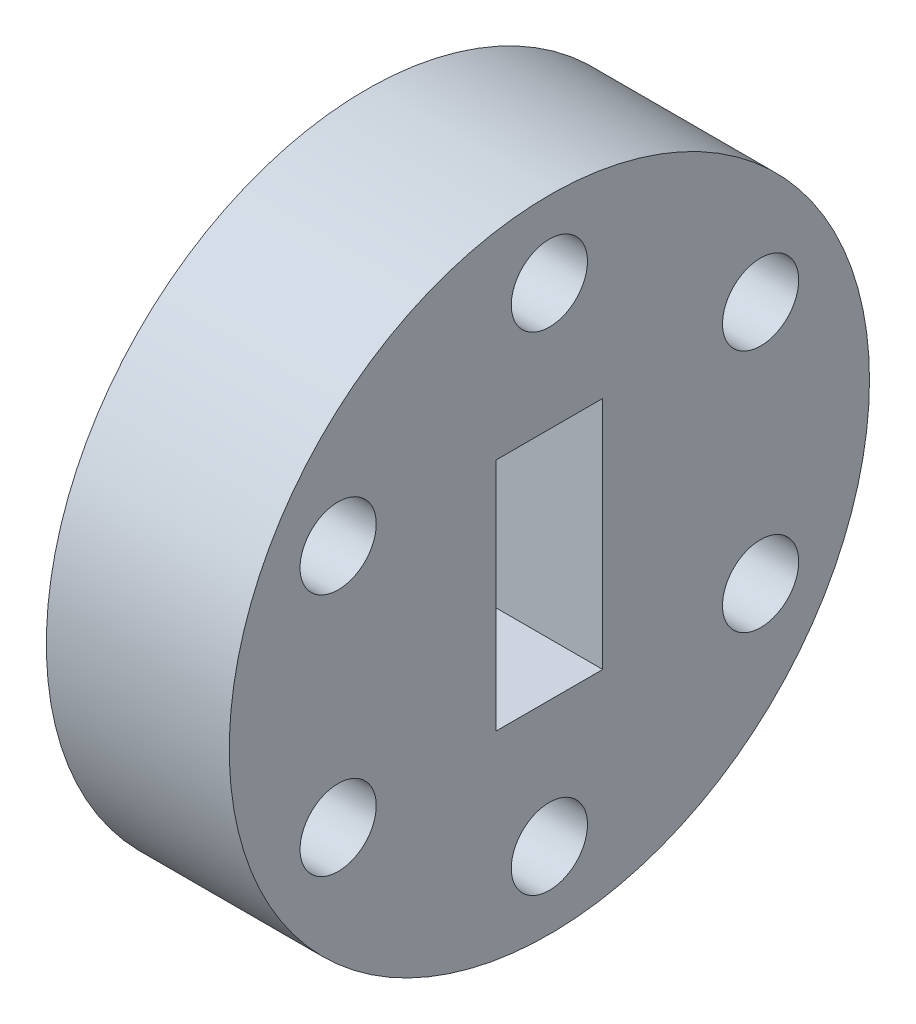
ISO-10303-21;
HEADER;
FILE_DESCRIPTION(('STEP AP214'),'2;1');
FILE_NAME('part.step','',(''),(''),'','','');
FILE_SCHEMA(('AUTOMOTIVE_DESIGN { 1 0 10303 214 1 1 1 1 }'));
ENDSEC;
DATA;
#1=APPLICATION_CONTEXT('core data for automotive mechanical design processes');
#2=APPLICATION_PROTOCOL_DEFINITION('international standard','automotive_design',2000,#1);
#3=PRODUCT_CONTEXT('',#1,'mechanical');
#4=PRODUCT('Part','Part','',(#3));
#5=PRODUCT_RELATED_PRODUCT_CATEGORY('part','',(#4));
#6=PRODUCT_DEFINITION_FORMATION('','',#4);
#7=PRODUCT_DEFINITION_CONTEXT('part definition',#1,'design');
#8=PRODUCT_DEFINITION('design','',#6,#7);
#9=PRODUCT_DEFINITION_SHAPE('','',#8);
#10=(LENGTH_UNIT() NAMED_UNIT(*) SI_UNIT(.MILLI.,.METRE.));
#11=(NAMED_UNIT(*) PLANE_ANGLE_UNIT() SI_UNIT($,.RADIAN.));
#12=(NAMED_UNIT(*) SI_UNIT($,.STERADIAN.) SOLID_ANGLE_UNIT());
#13=UNCERTAINTY_MEASURE_WITH_UNIT(LENGTH_MEASURE(1.E-05),#10,'distance_accuracy_value','');
#14=(GEOMETRIC_REPRESENTATION_CONTEXT(3) GLOBAL_UNCERTAINTY_ASSIGNED_CONTEXT((#13)) GLOBAL_UNIT_ASSIGNED_CONTEXT((#10,
#11,#12)) REPRESENTATION_CONTEXT('',''));
#15=CARTESIAN_POINT('',(0.,0.,0.));
#16=DIRECTION('',(0.,0.,1.));
#17=DIRECTION('',(1.,0.,0.));
#18=AXIS2_PLACEMENT_3D('',#15,#16,#17);
#19=CARTESIAN_POINT('',(6.,0.,0.));
#20=DIRECTION('',(-1.,0.,0.));
#21=DIRECTION('',(0.,0.,1.));
#22=AXIS2_PLACEMENT_3D('',#19,#20,#21);
#23=CYLINDRICAL_SURFACE('',#22,10.5);
#24=CARTESIAN_POINT('',(6.,0.,0.));
#25=DIRECTION('',(1.,0.,0.));
#26=DIRECTION('',(0.,0.,-1.));
#27=AXIS2_PLACEMENT_3D('',#24,#25,#26);
#28=CIRCLE('',#27,10.5);
#29=CARTESIAN_POINT('',(6.,0.,-10.5));
#30=VERTEX_POINT('',#29);
#31=EDGE_CURVE('E11',#30,#30,#28,.T.);
#32=ORIENTED_EDGE('',*,*,#31,.F.);
#33=EDGE_LOOP('',(#32));
#34=FACE_BOUND('',#33,.T.);
#35=CARTESIAN_POINT('',(0.,0.,0.));
#36=DIRECTION('',(1.,0.,0.));
#37=DIRECTION('',(0.,0.,-1.));
#38=AXIS2_PLACEMENT_3D('',#35,#36,#37);
#39=CIRCLE('',#38,10.5);
#40=CARTESIAN_POINT('',(0.,0.,-10.5));
#41=VERTEX_POINT('',#40);
#42=EDGE_CURVE('E39',#41,#41,#39,.T.);
#43=ORIENTED_EDGE('',*,*,#42,.T.);
#44=EDGE_LOOP('',(#43));
#45=FACE_BOUND('',#44,.T.);
#46=ADVANCED_FACE('F36',(#34,#45),#23,.T.);
#47=CARTESIAN_POINT('',(6.,0.,0.));
#48=DIRECTION('',(1.,0.,0.));
#49=DIRECTION('',(0.,0.,-1.));
#50=AXIS2_PLACEMENT_3D('',#47,#48,#49);
#51=PLANE('',#50);
#52=DIRECTION('',(0.,1.,0.));
#53=VECTOR('',#52,1.);
#54=CARTESIAN_POINT('',(6.,3.85,-1.75));
#55=LINE('',#54,#53);
#56=CARTESIAN_POINT('',(6.,-3.85,-1.75));
#57=VERTEX_POINT('',#56);
#58=CARTESIAN_POINT('',(6.,3.85,-1.75));
#59=VERTEX_POINT('',#58);
#60=EDGE_CURVE('E50',#57,#59,#55,.T.);
#61=ORIENTED_EDGE('',*,*,#60,.F.);
#62=DIRECTION('',(0.,0.,-1.));
#63=VECTOR('',#62,1.);
#64=CARTESIAN_POINT('',(6.,-3.85,1.75));
#65=LINE('',#64,#63);
#66=CARTESIAN_POINT('',(6.,-3.85,1.75));
#67=VERTEX_POINT('',#66);
#68=EDGE_CURVE('E94',#67,#57,#65,.T.);
#69=ORIENTED_EDGE('',*,*,#68,.F.);
#70=DIRECTION('',(0.,-1.,0.));
#71=VECTOR('',#70,1.);
#72=CARTESIAN_POINT('',(6.,3.85,1.75));
#73=LINE('',#72,#71);
#74=CARTESIAN_POINT('',(6.,3.85,1.75));
#75=VERTEX_POINT('',#74);
#76=EDGE_CURVE('E97',#75,#67,#73,.T.);
#77=ORIENTED_EDGE('',*,*,#76,.F.);
#78=DIRECTION('',(0.,0.,1.));
#79=VECTOR('',#78,1.);
#80=CARTESIAN_POINT('',(6.,3.85,1.75));
#81=LINE('',#80,#79);
#82=EDGE_CURVE('E103',#59,#75,#81,.T.);
#83=ORIENTED_EDGE('',*,*,#82,.F.);
#84=EDGE_LOOP('',(#61,#69,#77,#83));
#85=FACE_BOUND('',#84,.T.);
#86=CARTESIAN_POINT('',(6.,8.,0.));
#87=DIRECTION('',(1.,0.,0.));
#88=DIRECTION('',(0.,0.,-1.));
#89=AXIS2_PLACEMENT_3D('',#86,#87,#88);
#90=CIRCLE('',#89,1.25);
#91=CARTESIAN_POINT('',(6.,8.,-1.25));
#92=VERTEX_POINT('',#91);
#93=EDGE_CURVE('E116',#92,#92,#90,.T.);
#94=ORIENTED_EDGE('',*,*,#93,.F.);
#95=EDGE_LOOP('',(#94));
#96=FACE_BOUND('',#95,.T.);
#97=CARTESIAN_POINT('',(6.,3.99999999999969,6.92820323027534));
#98=DIRECTION('',(1.,0.,0.));
#99=DIRECTION('',(0.,0.,-1.));
#100=AXIS2_PLACEMENT_3D('',#97,#98,#99);
#101=CIRCLE('',#100,1.25);
#102=CARTESIAN_POINT('',(6.,3.99999999999969,5.67820323027534));
#103=VERTEX_POINT('',#102);
#104=EDGE_CURVE('E109',#103,#103,#101,.T.);
#105=ORIENTED_EDGE('',*,*,#104,.F.);
#106=EDGE_LOOP('',(#105));
#107=FACE_BOUND('',#106,.T.);
#108=CARTESIAN_POINT('',(6.,-4.00000000000031,6.92820323027498));
#109=DIRECTION('',(1.,0.,0.));
#110=DIRECTION('',(0.,0.,-1.));
#111=AXIS2_PLACEMENT_3D('',#108,#109,#110);
#112=CIRCLE('',#111,1.25);
#113=CARTESIAN_POINT('',(6.,-4.00000000000031,5.67820323027498));
#114=VERTEX_POINT('',#113);
#115=EDGE_CURVE('E140',#114,#114,#112,.T.);
#116=ORIENTED_EDGE('',*,*,#115,.F.);
#117=EDGE_LOOP('',(#116));
#118=FACE_BOUND('',#117,.T.);
#119=CARTESIAN_POINT('',(6.,4.00000000000031,-6.92820323027568));
#120=DIRECTION('',(1.,0.,0.));
#121=DIRECTION('',(0.,0.,-1.));
#122=AXIS2_PLACEMENT_3D('',#119,#120,#121);
#123=CIRCLE('',#122,1.25);
#124=CARTESIAN_POINT('',(6.,4.00000000000031,-8.17820323027569));
#125=VERTEX_POINT('',#124);
#126=EDGE_CURVE('E129',#125,#125,#123,.T.);
#127=ORIENTED_EDGE('',*,*,#126,.F.);
#128=EDGE_LOOP('',(#127));
#129=FACE_BOUND('',#128,.T.);
#130=CARTESIAN_POINT('',(6.,-3.99999999999969,-6.92820323027604));
#131=DIRECTION('',(1.,0.,0.));
#132=DIRECTION('',(0.,0.,-1.));
#133=AXIS2_PLACEMENT_3D('',#130,#131,#132);
#134=CIRCLE('',#133,1.25);
#135=CARTESIAN_POINT('',(6.,-3.99999999999969,-8.17820323027604));
#136=VERTEX_POINT('',#135);
#137=EDGE_CURVE('E130',#136,#136,#134,.T.);
#138=ORIENTED_EDGE('',*,*,#137,.F.);
#139=EDGE_LOOP('',(#138));
#140=FACE_BOUND('',#139,.T.);
#141=CARTESIAN_POINT('',(6.,-8.,-7.05399219203681E-13));
#142=DIRECTION('',(1.,0.,0.));
#143=DIRECTION('',(0.,0.,-1.));
#144=AXIS2_PLACEMENT_3D('',#141,#142,#143);
#145=CIRCLE('',#144,1.25);
#146=CARTESIAN_POINT('',(6.,-8.,-1.25000000000071));
#147=VERTEX_POINT('',#146);
#148=EDGE_CURVE('E123',#147,#147,#145,.T.);
#149=ORIENTED_EDGE('',*,*,#148,.F.);
#150=EDGE_LOOP('',(#149));
#151=FACE_BOUND('',#150,.T.);
#152=ORIENTED_EDGE('',*,*,#31,.T.);
#153=EDGE_LOOP('',(#152));
#154=FACE_BOUND('',#153,.T.);
#155=ADVANCED_FACE('F151',(#85,#96,#107,#118,#129,#140,#151,#154),#51,.T.);
#156=CARTESIAN_POINT('',(0.,0.,0.));
#157=DIRECTION('',(1.,0.,0.));
#158=DIRECTION('',(0.,0.,-1.));
#159=AXIS2_PLACEMENT_3D('',#156,#157,#158);
#160=PLANE('',#159);
#161=DIRECTION('',(0.,0.,-1.));
#162=VECTOR('',#161,1.);
#163=CARTESIAN_POINT('',(0.,-3.85,1.75));
#164=LINE('',#163,#162);
#165=CARTESIAN_POINT('',(0.,-3.85,1.75));
#166=VERTEX_POINT('',#165);
#167=CARTESIAN_POINT('',(0.,-3.85,-1.75));
#168=VERTEX_POINT('',#167);
#169=EDGE_CURVE('E84',#166,#168,#164,.T.);
#170=ORIENTED_EDGE('',*,*,#169,.T.);
#171=DIRECTION('',(0.,1.,0.));
#172=VECTOR('',#171,1.);
#173=CARTESIAN_POINT('',(0.,3.85,-1.75));
#174=LINE('',#173,#172);
#175=CARTESIAN_POINT('',(0.,3.85,-1.75));
#176=VERTEX_POINT('',#175);
#177=EDGE_CURVE('E78',#168,#176,#174,.T.);
#178=ORIENTED_EDGE('',*,*,#177,.T.);
#179=DIRECTION('',(0.,0.,1.));
#180=VECTOR('',#179,1.);
#181=CARTESIAN_POINT('',(0.,3.85,1.75));
#182=LINE('',#181,#180);
#183=CARTESIAN_POINT('',(0.,3.85,1.75));
#184=VERTEX_POINT('',#183);
#185=EDGE_CURVE('E87',#176,#184,#182,.T.);
#186=ORIENTED_EDGE('',*,*,#185,.T.);
#187=DIRECTION('',(0.,-1.,0.));
#188=VECTOR('',#187,1.);
#189=CARTESIAN_POINT('',(0.,3.85,1.75));
#190=LINE('',#189,#188);
#191=EDGE_CURVE('E58',#184,#166,#190,.T.);
#192=ORIENTED_EDGE('',*,*,#191,.T.);
#193=EDGE_LOOP('',(#170,#178,#186,#192));
#194=FACE_BOUND('',#193,.T.);
#195=CARTESIAN_POINT('',(0.,8.,0.));
#196=DIRECTION('',(1.,0.,0.));
#197=DIRECTION('',(0.,0.,-1.));
#198=AXIS2_PLACEMENT_3D('',#195,#196,#197);
#199=CIRCLE('',#198,1.25);
#200=CARTESIAN_POINT('',(0.,8.,-1.25));
#201=VERTEX_POINT('',#200);
#202=EDGE_CURVE('E113',#201,#201,#199,.T.);
#203=ORIENTED_EDGE('',*,*,#202,.T.);
#204=EDGE_LOOP('',(#203));
#205=FACE_BOUND('',#204,.T.);
#206=CARTESIAN_POINT('',(0.,3.99999999999969,6.92820323027534));
#207=DIRECTION('',(1.,0.,0.));
#208=DIRECTION('',(0.,0.,-1.));
#209=AXIS2_PLACEMENT_3D('',#206,#207,#208);
#210=CIRCLE('',#209,1.25);
#211=CARTESIAN_POINT('',(0.,3.99999999999969,5.67820323027534));
#212=VERTEX_POINT('',#211);
#213=EDGE_CURVE('E120',#212,#212,#210,.T.);
#214=ORIENTED_EDGE('',*,*,#213,.T.);
#215=EDGE_LOOP('',(#214));
#216=FACE_BOUND('',#215,.T.);
#217=CARTESIAN_POINT('',(0.,-4.00000000000031,6.92820323027498));
#218=DIRECTION('',(1.,0.,0.));
#219=DIRECTION('',(0.,0.,-1.));
#220=AXIS2_PLACEMENT_3D('',#217,#218,#219);
#221=CIRCLE('',#220,1.25);
#222=CARTESIAN_POINT('',(0.,-4.00000000000031,5.67820323027498));
#223=VERTEX_POINT('',#222);
#224=EDGE_CURVE('E119',#223,#223,#221,.T.);
#225=ORIENTED_EDGE('',*,*,#224,.T.);
#226=EDGE_LOOP('',(#225));
#227=FACE_BOUND('',#226,.T.);
#228=CARTESIAN_POINT('',(0.,4.00000000000031,-6.92820323027568));
#229=DIRECTION('',(1.,0.,0.));
#230=DIRECTION('',(0.,0.,-1.));
#231=AXIS2_PLACEMENT_3D('',#228,#229,#230);
#232=CIRCLE('',#231,1.25);
#233=CARTESIAN_POINT('',(0.,4.00000000000031,-8.17820323027569));
#234=VERTEX_POINT('',#233);
#235=EDGE_CURVE('E143',#234,#234,#232,.T.);
#236=ORIENTED_EDGE('',*,*,#235,.T.);
#237=EDGE_LOOP('',(#236));
#238=FACE_BOUND('',#237,.T.);
#239=CARTESIAN_POINT('',(0.,-3.99999999999969,-6.92820323027604));
#240=DIRECTION('',(1.,0.,0.));
#241=DIRECTION('',(0.,0.,-1.));
#242=AXIS2_PLACEMENT_3D('',#239,#240,#241);
#243=CIRCLE('',#242,1.25);
#244=CARTESIAN_POINT('',(0.,-3.99999999999969,-8.17820323027604));
#245=VERTEX_POINT('',#244);
#246=EDGE_CURVE('E126',#245,#245,#243,.T.);
#247=ORIENTED_EDGE('',*,*,#246,.T.);
#248=EDGE_LOOP('',(#247));
#249=FACE_BOUND('',#248,.T.);
#250=CARTESIAN_POINT('',(0.,-8.,-7.05399219203681E-13));
#251=DIRECTION('',(1.,0.,0.));
#252=DIRECTION('',(0.,0.,-1.));
#253=AXIS2_PLACEMENT_3D('',#250,#251,#252);
#254=CIRCLE('',#253,1.25);
#255=CARTESIAN_POINT('',(0.,-8.,-1.25000000000071));
#256=VERTEX_POINT('',#255);
#257=EDGE_CURVE('E133',#256,#256,#254,.T.);
#258=ORIENTED_EDGE('',*,*,#257,.T.);
#259=EDGE_LOOP('',(#258));
#260=FACE_BOUND('',#259,.T.);
#261=ORIENTED_EDGE('',*,*,#42,.F.);
#262=EDGE_LOOP('',(#261));
#263=FACE_BOUND('',#262,.T.);
#264=ADVANCED_FACE('F91',(#194,#205,#216,#227,#238,#249,#260,#263),#160,.F.);
#265=CARTESIAN_POINT('',(0.,-8.,-7.05399219203681E-13));
#266=DIRECTION('',(1.,0.,0.));
#267=DIRECTION('',(0.,0.,-1.));
#268=AXIS2_PLACEMENT_3D('',#265,#266,#267);
#269=CYLINDRICAL_SURFACE('',#268,1.25);
#270=ORIENTED_EDGE('',*,*,#257,.F.);
#271=EDGE_LOOP('',(#270));
#272=FACE_BOUND('',#271,.T.);
#273=ORIENTED_EDGE('',*,*,#148,.T.);
#274=EDGE_LOOP('',(#273));
#275=FACE_BOUND('',#274,.T.);
#276=ADVANCED_FACE('F168',(#272,#275),#269,.F.);
#277=CARTESIAN_POINT('',(0.,-3.99999999999969,-6.92820323027604));
#278=DIRECTION('',(1.,0.,0.));
#279=DIRECTION('',(0.,0.,-1.));
#280=AXIS2_PLACEMENT_3D('',#277,#278,#279);
#281=CYLINDRICAL_SURFACE('',#280,1.25);
#282=ORIENTED_EDGE('',*,*,#246,.F.);
#283=EDGE_LOOP('',(#282));
#284=FACE_BOUND('',#283,.T.);
#285=ORIENTED_EDGE('',*,*,#137,.T.);
#286=EDGE_LOOP('',(#285));
#287=FACE_BOUND('',#286,.T.);
#288=ADVANCED_FACE('F172',(#284,#287),#281,.F.);
#289=CARTESIAN_POINT('',(0.,4.00000000000031,-6.92820323027568));
#290=DIRECTION('',(1.,0.,0.));
#291=DIRECTION('',(0.,0.,-1.));
#292=AXIS2_PLACEMENT_3D('',#289,#290,#291);
#293=CYLINDRICAL_SURFACE('',#292,1.25);
#294=ORIENTED_EDGE('',*,*,#235,.F.);
#295=EDGE_LOOP('',(#294));
#296=FACE_BOUND('',#295,.T.);
#297=ORIENTED_EDGE('',*,*,#126,.T.);
#298=EDGE_LOOP('',(#297));
#299=FACE_BOUND('',#298,.T.);
#300=ADVANCED_FACE('F149',(#296,#299),#293,.F.);
#301=CARTESIAN_POINT('',(0.,-4.00000000000031,6.92820323027498));
#302=DIRECTION('',(1.,0.,0.));
#303=DIRECTION('',(0.,0.,-1.));
#304=AXIS2_PLACEMENT_3D('',#301,#302,#303);
#305=CYLINDRICAL_SURFACE('',#304,1.25);
#306=ORIENTED_EDGE('',*,*,#224,.F.);
#307=EDGE_LOOP('',(#306));
#308=FACE_BOUND('',#307,.T.);
#309=ORIENTED_EDGE('',*,*,#115,.T.);
#310=EDGE_LOOP('',(#309));
#311=FACE_BOUND('',#310,.T.);
#312=ADVANCED_FACE('F178',(#308,#311),#305,.F.);
#313=CARTESIAN_POINT('',(0.,3.99999999999969,6.92820323027534));
#314=DIRECTION('',(1.,0.,0.));
#315=DIRECTION('',(0.,0.,-1.));
#316=AXIS2_PLACEMENT_3D('',#313,#314,#315);
#317=CYLINDRICAL_SURFACE('',#316,1.25);
#318=ORIENTED_EDGE('',*,*,#213,.F.);
#319=EDGE_LOOP('',(#318));
#320=FACE_BOUND('',#319,.T.);
#321=ORIENTED_EDGE('',*,*,#104,.T.);
#322=EDGE_LOOP('',(#321));
#323=FACE_BOUND('',#322,.T.);
#324=ADVANCED_FACE('F181',(#320,#323),#317,.F.);
#325=CARTESIAN_POINT('',(0.,8.,0.));
#326=DIRECTION('',(1.,0.,0.));
#327=DIRECTION('',(0.,0.,-1.));
#328=AXIS2_PLACEMENT_3D('',#325,#326,#327);
#329=CYLINDRICAL_SURFACE('',#328,1.25);
#330=ORIENTED_EDGE('',*,*,#202,.F.);
#331=EDGE_LOOP('',(#330));
#332=FACE_BOUND('',#331,.T.);
#333=ORIENTED_EDGE('',*,*,#93,.T.);
#334=EDGE_LOOP('',(#333));
#335=FACE_BOUND('',#334,.T.);
#336=ADVANCED_FACE('F189',(#332,#335),#329,.F.);
#337=CARTESIAN_POINT('',(0.,3.85,-1.75));
#338=DIRECTION('',(0.,0.,-1.));
#339=DIRECTION('',(0.,1.,0.));
#340=AXIS2_PLACEMENT_3D('',#337,#338,#339);
#341=PLANE('',#340);
#342=ORIENTED_EDGE('',*,*,#60,.T.);
#343=DIRECTION('',(1.,0.,0.));
#344=VECTOR('',#343,1.);
#345=CARTESIAN_POINT('',(0.,3.85,-1.75));
#346=LINE('',#345,#344);
#347=EDGE_CURVE('E74',#176,#59,#346,.T.);
#348=ORIENTED_EDGE('',*,*,#347,.F.);
#349=ORIENTED_EDGE('',*,*,#177,.F.);
#350=DIRECTION('',(1.,0.,0.));
#351=VECTOR('',#350,1.);
#352=CARTESIAN_POINT('',(0.,-3.85,-1.75));
#353=LINE('',#352,#351);
#354=EDGE_CURVE('E107',#168,#57,#353,.T.);
#355=ORIENTED_EDGE('',*,*,#354,.T.);
#356=EDGE_LOOP('',(#342,#348,#349,#355));
#357=FACE_BOUND('',#356,.T.);
#358=ADVANCED_FACE('F76',(#357),#341,.F.);
#359=CARTESIAN_POINT('',(0.,-3.85,1.75));
#360=DIRECTION('',(0.,-1.,0.));
#361=DIRECTION('',(0.,0.,-1.));
#362=AXIS2_PLACEMENT_3D('',#359,#360,#361);
#363=PLANE('',#362);
#364=ORIENTED_EDGE('',*,*,#68,.T.);
#365=ORIENTED_EDGE('',*,*,#354,.F.);
#366=ORIENTED_EDGE('',*,*,#169,.F.);
#367=DIRECTION('',(1.,0.,0.));
#368=VECTOR('',#367,1.);
#369=CARTESIAN_POINT('',(0.,-3.85,1.75));
#370=LINE('',#369,#368);
#371=EDGE_CURVE('E110',#166,#67,#370,.T.);
#372=ORIENTED_EDGE('',*,*,#371,.T.);
#373=EDGE_LOOP('',(#364,#365,#366,#372));
#374=FACE_BOUND('',#373,.T.);
#375=ADVANCED_FACE('F196',(#374),#363,.F.);
#376=CARTESIAN_POINT('',(0.,3.85,1.75));
#377=DIRECTION('',(0.,0.,1.));
#378=DIRECTION('',(0.,-1.,0.));
#379=AXIS2_PLACEMENT_3D('',#376,#377,#378);
#380=PLANE('',#379);
#381=ORIENTED_EDGE('',*,*,#76,.T.);
#382=ORIENTED_EDGE('',*,*,#371,.F.);
#383=ORIENTED_EDGE('',*,*,#191,.F.);
#384=DIRECTION('',(1.,0.,0.));
#385=VECTOR('',#384,1.);
#386=CARTESIAN_POINT('',(0.,3.85,1.75));
#387=LINE('',#386,#385);
#388=EDGE_CURVE('E83',#184,#75,#387,.T.);
#389=ORIENTED_EDGE('',*,*,#388,.T.);
#390=EDGE_LOOP('',(#381,#382,#383,#389));
#391=FACE_BOUND('',#390,.T.);
#392=ADVANCED_FACE('F199',(#391),#380,.F.);
#393=CARTESIAN_POINT('',(0.,3.85,1.75));
#394=DIRECTION('',(0.,1.,0.));
#395=DIRECTION('',(0.,0.,1.));
#396=AXIS2_PLACEMENT_3D('',#393,#394,#395);
#397=PLANE('',#396);
#398=ORIENTED_EDGE('',*,*,#82,.T.);
#399=ORIENTED_EDGE('',*,*,#388,.F.);
#400=ORIENTED_EDGE('',*,*,#185,.F.);
#401=ORIENTED_EDGE('',*,*,#347,.T.);
#402=EDGE_LOOP('',(#398,#399,#400,#401));
#403=FACE_BOUND('',#402,.T.);
#404=ADVANCED_FACE('F88',(#403),#397,.F.);
#405=CLOSED_SHELL('',(#46,#155,#264,#276,#288,#300,#312,#324,#336,#358,#375,#392,#404));
#406=MANIFOLD_SOLID_BREP('B2',#405);
#407=ADVANCED_BREP_SHAPE_REPRESENTATION('',(#18,#406),#14);
#408=SHAPE_DEFINITION_REPRESENTATION(#9,#407);
ENDSEC;
END-ISO-10303-21;
